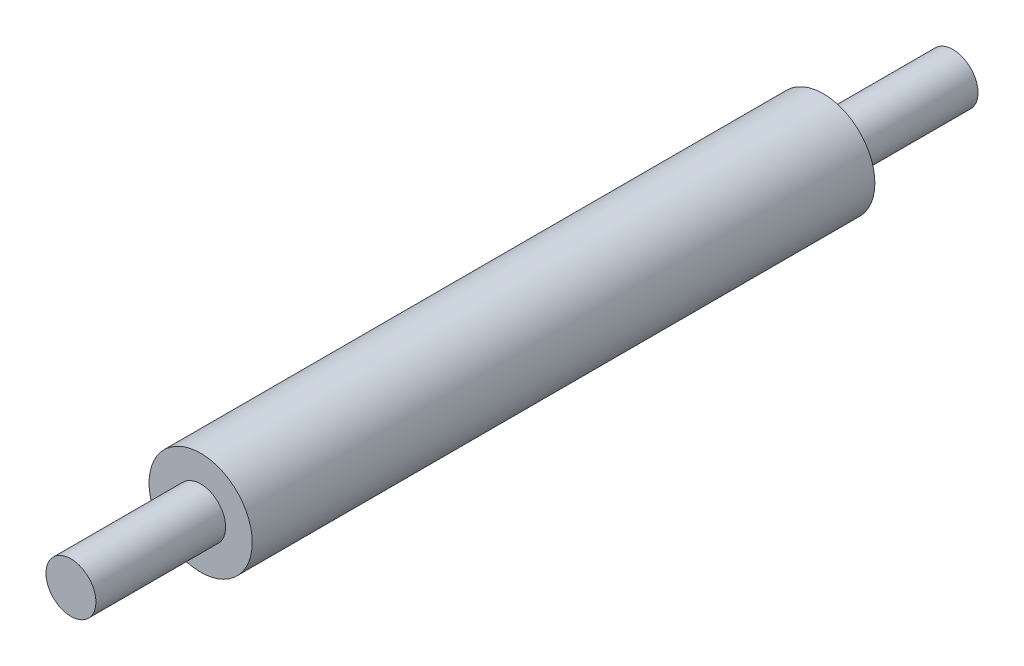
ISO-10303-21;
HEADER;
FILE_DESCRIPTION(('STEP AP214'),'2;1');
FILE_NAME('part.step','',(''),(''),'','','');
FILE_SCHEMA(('AUTOMOTIVE_DESIGN { 1 0 10303 214 1 1 1 1 }'));
ENDSEC;
DATA;
#1=APPLICATION_CONTEXT('core data for automotive mechanical design processes');
#2=APPLICATION_PROTOCOL_DEFINITION('international standard','automotive_design',2000,#1);
#3=PRODUCT_CONTEXT('',#1,'mechanical');
#4=PRODUCT('Part','Part','',(#3));
#5=PRODUCT_RELATED_PRODUCT_CATEGORY('part','',(#4));
#6=PRODUCT_DEFINITION_FORMATION('','',#4);
#7=PRODUCT_DEFINITION_CONTEXT('part definition',#1,'design');
#8=PRODUCT_DEFINITION('design','',#6,#7);
#9=PRODUCT_DEFINITION_SHAPE('','',#8);
#10=(LENGTH_UNIT() NAMED_UNIT(*) SI_UNIT(.MILLI.,.METRE.));
#11=(NAMED_UNIT(*) PLANE_ANGLE_UNIT() SI_UNIT($,.RADIAN.));
#12=(NAMED_UNIT(*) SI_UNIT($,.STERADIAN.) SOLID_ANGLE_UNIT());
#13=UNCERTAINTY_MEASURE_WITH_UNIT(LENGTH_MEASURE(1.E-05),#10,'distance_accuracy_value','');
#14=(GEOMETRIC_REPRESENTATION_CONTEXT(3) GLOBAL_UNCERTAINTY_ASSIGNED_CONTEXT((#13)) GLOBAL_UNIT_ASSIGNED_CONTEXT((#10,
#11,#12)) REPRESENTATION_CONTEXT('',''));
#15=CARTESIAN_POINT('',(0.,0.,0.));
#16=DIRECTION('',(0.,0.,1.));
#17=DIRECTION('',(1.,0.,0.));
#18=AXIS2_PLACEMENT_3D('',#15,#16,#17);
#19=CARTESIAN_POINT('',(0.,0.,48.));
#20=DIRECTION('',(0.,0.,-1.));
#21=DIRECTION('',(-1.,0.,0.));
#22=AXIS2_PLACEMENT_3D('',#19,#20,#21);
#23=CYLINDRICAL_SURFACE('',#22,7.95);
#24=CARTESIAN_POINT('',(0.,0.,48.));
#25=DIRECTION('',(0.,0.,1.));
#26=DIRECTION('',(1.,0.,0.));
#27=AXIS2_PLACEMENT_3D('',#24,#25,#26);
#28=CIRCLE('',#27,7.95);
#29=CARTESIAN_POINT('',(7.95,0.,48.));
#30=VERTEX_POINT('',#29);
#31=EDGE_CURVE('E42',#30,#30,#28,.T.);
#32=ORIENTED_EDGE('',*,*,#31,.F.);
#33=EDGE_LOOP('',(#32));
#34=FACE_BOUND('',#33,.T.);
#35=CARTESIAN_POINT('',(0.,0.,-48.));
#36=DIRECTION('',(0.,0.,1.));
#37=DIRECTION('',(1.,0.,0.));
#38=AXIS2_PLACEMENT_3D('',#35,#36,#37);
#39=CIRCLE('',#38,7.95);
#40=CARTESIAN_POINT('',(7.95,0.,-48.));
#41=VERTEX_POINT('',#40);
#42=EDGE_CURVE('E38',#41,#41,#39,.T.);
#43=ORIENTED_EDGE('',*,*,#42,.T.);
#44=EDGE_LOOP('',(#43));
#45=FACE_BOUND('',#44,.T.);
#46=ADVANCED_FACE('F35',(#34,#45),#23,.T.);
#47=CARTESIAN_POINT('',(0.,0.,48.));
#48=DIRECTION('',(0.,0.,1.));
#49=DIRECTION('',(1.,0.,0.));
#50=AXIS2_PLACEMENT_3D('',#47,#48,#49);
#51=PLANE('',#50);
#52=CARTESIAN_POINT('',(0.,0.,48.));
#53=DIRECTION('',(0.,0.,1.));
#54=DIRECTION('',(1.,0.,0.));
#55=AXIS2_PLACEMENT_3D('',#52,#53,#54);
#56=CIRCLE('',#55,3.85);
#57=CARTESIAN_POINT('',(3.85,0.,48.));
#58=VERTEX_POINT('',#57);
#59=EDGE_CURVE('E10',#58,#58,#56,.T.);
#60=ORIENTED_EDGE('',*,*,#59,.F.);
#61=EDGE_LOOP('',(#60));
#62=FACE_BOUND('',#61,.T.);
#63=ORIENTED_EDGE('',*,*,#31,.T.);
#64=EDGE_LOOP('',(#63));
#65=FACE_BOUND('',#64,.T.);
#66=ADVANCED_FACE('F70',(#62,#65),#51,.T.);
#67=CARTESIAN_POINT('',(0.,0.,-48.));
#68=DIRECTION('',(0.,0.,1.));
#69=DIRECTION('',(1.,0.,0.));
#70=AXIS2_PLACEMENT_3D('',#67,#68,#69);
#71=PLANE('',#70);
#72=CARTESIAN_POINT('',(0.,0.,-48.));
#73=DIRECTION('',(0.,0.,1.));
#74=DIRECTION('',(1.,0.,0.));
#75=AXIS2_PLACEMENT_3D('',#72,#73,#74);
#76=CIRCLE('',#75,3.85);
#77=CARTESIAN_POINT('',(3.85,0.,-48.));
#78=VERTEX_POINT('',#77);
#79=EDGE_CURVE('E52',#78,#78,#76,.T.);
#80=ORIENTED_EDGE('',*,*,#79,.T.);
#81=EDGE_LOOP('',(#80));
#82=FACE_BOUND('',#81,.T.);
#83=ORIENTED_EDGE('',*,*,#42,.F.);
#84=EDGE_LOOP('',(#83));
#85=FACE_BOUND('',#84,.T.);
#86=ADVANCED_FACE('F75',(#82,#85),#71,.F.);
#87=CARTESIAN_POINT('',(0.,0.,68.));
#88=DIRECTION('',(0.,0.,-1.));
#89=DIRECTION('',(-1.,0.,0.));
#90=AXIS2_PLACEMENT_3D('',#87,#88,#89);
#91=CYLINDRICAL_SURFACE('',#90,3.85);
#92=CARTESIAN_POINT('',(0.,0.,68.));
#93=DIRECTION('',(0.,0.,1.));
#94=DIRECTION('',(1.,0.,0.));
#95=AXIS2_PLACEMENT_3D('',#92,#93,#94);
#96=CIRCLE('',#95,3.85);
#97=CARTESIAN_POINT('',(3.85,0.,68.));
#98=VERTEX_POINT('',#97);
#99=EDGE_CURVE('E48',#98,#98,#96,.T.);
#100=ORIENTED_EDGE('',*,*,#99,.F.);
#101=EDGE_LOOP('',(#100));
#102=FACE_BOUND('',#101,.T.);
#103=ORIENTED_EDGE('',*,*,#59,.T.);
#104=EDGE_LOOP('',(#103));
#105=FACE_BOUND('',#104,.T.);
#106=ADVANCED_FACE('F84',(#102,#105),#91,.T.);
#107=CARTESIAN_POINT('',(0.,0.,68.));
#108=DIRECTION('',(0.,0.,1.));
#109=DIRECTION('',(1.,0.,0.));
#110=AXIS2_PLACEMENT_3D('',#107,#108,#109);
#111=PLANE('',#110);
#112=ORIENTED_EDGE('',*,*,#99,.T.);
#113=EDGE_LOOP('',(#112));
#114=FACE_BOUND('',#113,.T.);
#115=ADVANCED_FACE('F67',(#114),#111,.T.);
#116=CARTESIAN_POINT('',(0.,0.,-68.));
#117=DIRECTION('',(0.,0.,1.));
#118=DIRECTION('',(1.,0.,0.));
#119=AXIS2_PLACEMENT_3D('',#116,#117,#118);
#120=CYLINDRICAL_SURFACE('',#119,3.85);
#121=CARTESIAN_POINT('',(0.,0.,-68.));
#122=DIRECTION('',(0.,0.,1.));
#123=DIRECTION('',(1.,0.,0.));
#124=AXIS2_PLACEMENT_3D('',#121,#122,#123);
#125=CIRCLE('',#124,3.85);
#126=CARTESIAN_POINT('',(3.85,0.,-68.));
#127=VERTEX_POINT('',#126);
#128=EDGE_CURVE('E51',#127,#127,#125,.T.);
#129=ORIENTED_EDGE('',*,*,#128,.T.);
#130=EDGE_LOOP('',(#129));
#131=FACE_BOUND('',#130,.T.);
#132=ORIENTED_EDGE('',*,*,#79,.F.);
#133=EDGE_LOOP('',(#132));
#134=FACE_BOUND('',#133,.T.);
#135=ADVANCED_FACE('F58',(#131,#134),#120,.T.);
#136=CARTESIAN_POINT('',(0.,0.,-68.));
#137=DIRECTION('',(0.,0.,-1.));
#138=DIRECTION('',(1.,0.,0.));
#139=AXIS2_PLACEMENT_3D('',#136,#137,#138);
#140=PLANE('',#139);
#141=ORIENTED_EDGE('',*,*,#128,.F.);
#142=EDGE_LOOP('',(#141));
#143=FACE_BOUND('',#142,.T.);
#144=ADVANCED_FACE('F61',(#143),#140,.T.);
#145=CLOSED_SHELL('',(#46,#66,#86,#106,#115,#135,#144));
#146=MANIFOLD_SOLID_BREP('B2',#145);
#147=ADVANCED_BREP_SHAPE_REPRESENTATION('',(#18,#146),#14);
#148=SHAPE_DEFINITION_REPRESENTATION(#9,#147);
ENDSEC;
END-ISO-10303-21;
